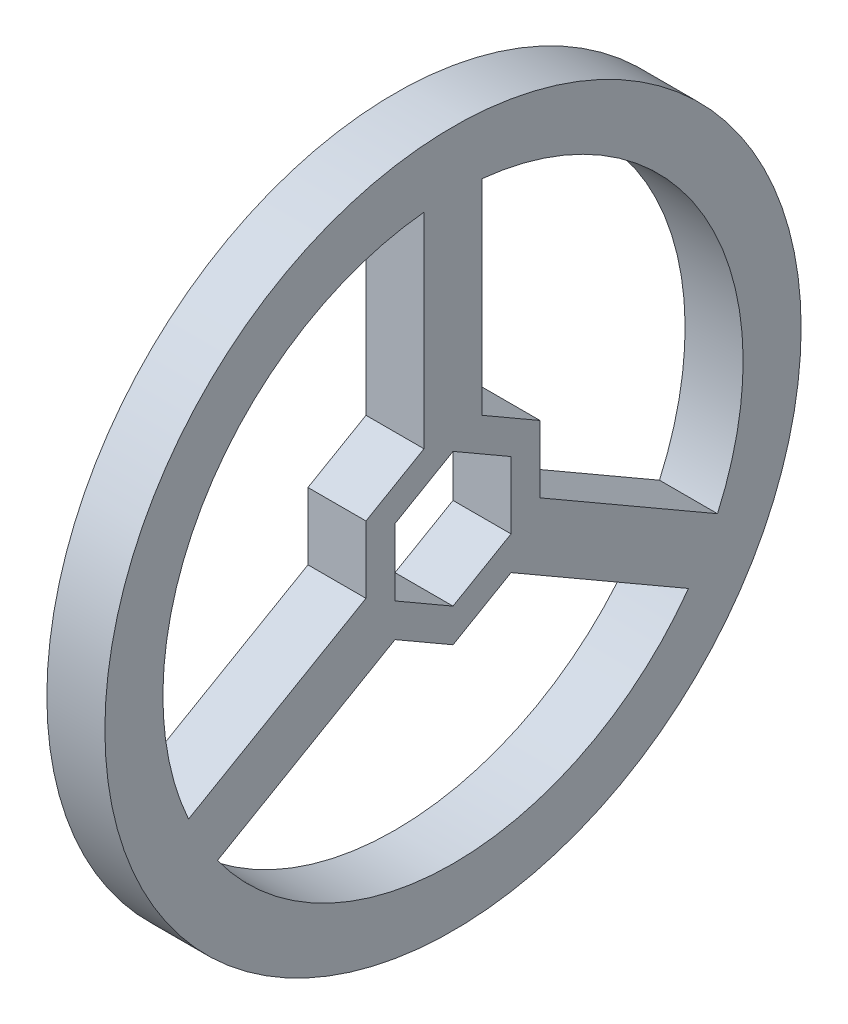
ISO-10303-21;
HEADER;
FILE_DESCRIPTION(('STEP AP214'),'2;1');
FILE_NAME('part.step','',(''),(''),'','','');
FILE_SCHEMA(('AUTOMOTIVE_DESIGN { 1 0 10303 214 1 1 1 1 }'));
ENDSEC;
DATA;
#1=APPLICATION_CONTEXT('core data for automotive mechanical design processes');
#2=APPLICATION_PROTOCOL_DEFINITION('international standard','automotive_design',2000,#1);
#3=PRODUCT_CONTEXT('',#1,'mechanical');
#4=PRODUCT('Part','Part','',(#3));
#5=PRODUCT_RELATED_PRODUCT_CATEGORY('part','',(#4));
#6=PRODUCT_DEFINITION_FORMATION('','',#4);
#7=PRODUCT_DEFINITION_CONTEXT('part definition',#1,'design');
#8=PRODUCT_DEFINITION('design','',#6,#7);
#9=PRODUCT_DEFINITION_SHAPE('','',#8);
#10=(LENGTH_UNIT() NAMED_UNIT(*) SI_UNIT(.MILLI.,.METRE.));
#11=(NAMED_UNIT(*) PLANE_ANGLE_UNIT() SI_UNIT($,.RADIAN.));
#12=(NAMED_UNIT(*) SI_UNIT($,.STERADIAN.) SOLID_ANGLE_UNIT());
#13=UNCERTAINTY_MEASURE_WITH_UNIT(LENGTH_MEASURE(1.E-05),#10,'distance_accuracy_value','');
#14=(GEOMETRIC_REPRESENTATION_CONTEXT(3) GLOBAL_UNCERTAINTY_ASSIGNED_CONTEXT((#13)) GLOBAL_UNIT_ASSIGNED_CONTEXT((#10,
#11,#12)) REPRESENTATION_CONTEXT('',''));
#15=CARTESIAN_POINT('',(0.,0.,0.));
#16=DIRECTION('',(0.,0.,1.));
#17=DIRECTION('',(1.,0.,0.));
#18=AXIS2_PLACEMENT_3D('',#15,#16,#17);
#19=CARTESIAN_POINT('',(5.,2.16506350946109,-1.25000000000001));
#20=DIRECTION('',(0.,0.866025403784436,-0.500000000000004));
#21=DIRECTION('',(0.,0.500000000000004,0.866025403784436));
#22=AXIS2_PLACEMENT_3D('',#19,#20,#21);
#23=PLANE('',#22);
#24=DIRECTION('',(0.,-0.500000000000004,-0.866025403784436));
#25=VECTOR('',#24,1.);
#26=CARTESIAN_POINT('',(0.,2.16506350946109,-1.25000000000001));
#27=LINE('',#26,#25);
#28=CARTESIAN_POINT('',(0.,-1.4433756729741,-7.5));
#29=VERTEX_POINT('',#28);
#30=CARTESIAN_POINT('',(0.,-10.2722794543718,-22.7921099245176));
#31=VERTEX_POINT('',#30);
#32=EDGE_CURVE('E312',#29,#31,#27,.T.);
#33=ORIENTED_EDGE('',*,*,#32,.F.);
#34=DIRECTION('',(-1.,0.,0.));
#35=VECTOR('',#34,1.);
#36=CARTESIAN_POINT('',(5.,-1.4433756729741,-7.5));
#37=LINE('',#36,#35);
#38=CARTESIAN_POINT('',(5.,-1.4433756729741,-7.5));
#39=VERTEX_POINT('',#38);
#40=EDGE_CURVE('E11',#39,#29,#37,.T.);
#41=ORIENTED_EDGE('',*,*,#40,.F.);
#42=DIRECTION('',(0.,-0.500000000000004,-0.866025403784436));
#43=VECTOR('',#42,1.);
#44=CARTESIAN_POINT('',(5.,2.16506350946109,-1.25000000000001));
#45=LINE('',#44,#43);
#46=CARTESIAN_POINT('',(5.,-10.2722794543718,-22.7921099245176));
#47=VERTEX_POINT('',#46);
#48=EDGE_CURVE('E370',#39,#47,#45,.T.);
#49=ORIENTED_EDGE('',*,*,#48,.T.);
#50=DIRECTION('',(-1.,0.,0.));
#51=VECTOR('',#50,1.);
#52=CARTESIAN_POINT('',(5.,-10.2722794543718,-22.7921099245176));
#53=LINE('',#52,#51);
#54=EDGE_CURVE('E58',#47,#31,#53,.T.);
#55=ORIENTED_EDGE('',*,*,#54,.T.);
#56=EDGE_LOOP('',(#33,#41,#49,#55));
#57=FACE_BOUND('',#56,.T.);
#58=ADVANCED_FACE('F39',(#57),#23,.T.);
#59=CARTESIAN_POINT('',(5.,0.,-7.5));
#60=DIRECTION('',(0.,0.,1.));
#61=DIRECTION('',(0.,-1.,0.));
#62=AXIS2_PLACEMENT_3D('',#59,#60,#61);
#63=PLANE('',#62);
#64=DIRECTION('',(0.,1.,0.));
#65=VECTOR('',#64,1.);
#66=CARTESIAN_POINT('',(0.,0.,-7.5));
#67=LINE('',#66,#65);
#68=CARTESIAN_POINT('',(0.,4.3301270189222,-7.5));
#69=VERTEX_POINT('',#68);
#70=EDGE_CURVE('E314',#29,#69,#67,.T.);
#71=ORIENTED_EDGE('',*,*,#70,.T.);
#72=DIRECTION('',(-1.,0.,0.));
#73=VECTOR('',#72,1.);
#74=CARTESIAN_POINT('',(5.,4.3301270189222,-7.5));
#75=LINE('',#74,#73);
#76=CARTESIAN_POINT('',(5.,4.3301270189222,-7.5));
#77=VERTEX_POINT('',#76);
#78=EDGE_CURVE('E49',#77,#69,#75,.T.);
#79=ORIENTED_EDGE('',*,*,#78,.F.);
#80=DIRECTION('',(0.,1.,0.));
#81=VECTOR('',#80,1.);
#82=CARTESIAN_POINT('',(5.,0.,-7.5));
#83=LINE('',#82,#81);
#84=EDGE_CURVE('E205',#39,#77,#83,.T.);
#85=ORIENTED_EDGE('',*,*,#84,.F.);
#86=ORIENTED_EDGE('',*,*,#40,.T.);
#87=EDGE_LOOP('',(#71,#79,#85,#86));
#88=FACE_BOUND('',#87,.T.);
#89=ADVANCED_FACE('F391',(#88),#63,.F.);
#90=CARTESIAN_POINT('',(5.,6.49519052838329,-3.75));
#91=DIRECTION('',(0.,-0.866025403784439,0.5));
#92=DIRECTION('',(0.,-0.5,-0.866025403784439));
#93=AXIS2_PLACEMENT_3D('',#90,#91,#92);
#94=PLANE('',#93);
#95=DIRECTION('',(0.,0.5,0.866025403784439));
#96=VECTOR('',#95,1.);
#97=CARTESIAN_POINT('',(0.,6.49519052838329,-3.75));
#98=LINE('',#97,#96);
#99=CARTESIAN_POINT('',(0.,7.21687836487032,-2.5));
#100=VERTEX_POINT('',#99);
#101=EDGE_CURVE('E211',#69,#100,#98,.T.);
#102=ORIENTED_EDGE('',*,*,#101,.T.);
#103=DIRECTION('',(-1.,0.,0.));
#104=VECTOR('',#103,1.);
#105=CARTESIAN_POINT('',(5.,7.21687836487032,-2.5));
#106=LINE('',#105,#104);
#107=CARTESIAN_POINT('',(5.,7.21687836487032,-2.5));
#108=VERTEX_POINT('',#107);
#109=EDGE_CURVE('E193',#108,#100,#106,.T.);
#110=ORIENTED_EDGE('',*,*,#109,.F.);
#111=DIRECTION('',(0.,0.5,0.866025403784439));
#112=VECTOR('',#111,1.);
#113=CARTESIAN_POINT('',(5.,6.49519052838329,-3.75));
#114=LINE('',#113,#112);
#115=EDGE_CURVE('E198',#77,#108,#114,.T.);
#116=ORIENTED_EDGE('',*,*,#115,.F.);
#117=ORIENTED_EDGE('',*,*,#78,.T.);
#118=EDGE_LOOP('',(#102,#110,#116,#117));
#119=FACE_BOUND('',#118,.T.);
#120=ADVANCED_FACE('F210',(#119),#94,.F.);
#121=CARTESIAN_POINT('',(5.,0.,-2.5));
#122=DIRECTION('',(0.,0.,1.));
#123=DIRECTION('',(1.,0.,0.));
#124=AXIS2_PLACEMENT_3D('',#121,#122,#123);
#125=PLANE('',#124);
#126=DIRECTION('',(0.,1.,0.));
#127=VECTOR('',#126,1.);
#128=CARTESIAN_POINT('',(0.,0.,-2.5));
#129=LINE('',#128,#127);
#130=CARTESIAN_POINT('',(0.,24.8746859276655,-2.5));
#131=VERTEX_POINT('',#130);
#132=EDGE_CURVE('E318',#100,#131,#129,.T.);
#133=ORIENTED_EDGE('',*,*,#132,.T.);
#134=DIRECTION('',(-1.,0.,0.));
#135=VECTOR('',#134,1.);
#136=CARTESIAN_POINT('',(5.,24.8746859276655,-2.5));
#137=LINE('',#136,#135);
#138=CARTESIAN_POINT('',(5.,24.8746859276655,-2.5));
#139=VERTEX_POINT('',#138);
#140=EDGE_CURVE('E123',#139,#131,#137,.T.);
#141=ORIENTED_EDGE('',*,*,#140,.F.);
#142=DIRECTION('',(0.,1.,0.));
#143=VECTOR('',#142,1.);
#144=CARTESIAN_POINT('',(5.,0.,-2.5));
#145=LINE('',#144,#143);
#146=EDGE_CURVE('E189',#108,#139,#145,.T.);
#147=ORIENTED_EDGE('',*,*,#146,.F.);
#148=ORIENTED_EDGE('',*,*,#109,.T.);
#149=EDGE_LOOP('',(#133,#141,#147,#148));
#150=FACE_BOUND('',#149,.T.);
#151=ADVANCED_FACE('F191',(#150),#125,.F.);
#152=CARTESIAN_POINT('',(5.,-4.33012701892219,2.5));
#153=DIRECTION('',(0.,0.866025403784438,-0.5));
#154=DIRECTION('',(0.,0.5,0.866025403784439));
#155=AXIS2_PLACEMENT_3D('',#152,#153,#154);
#156=PLANE('',#155);
#157=DIRECTION('',(0.,-0.5,-0.866025403784439));
#158=VECTOR('',#157,1.);
#159=CARTESIAN_POINT('',(0.,-4.33012701892219,2.5));
#160=LINE('',#159,#158);
#161=CARTESIAN_POINT('',(0.,-2.88675134594813,5.));
#162=VERTEX_POINT('',#161);
#163=CARTESIAN_POINT('',(0.,-5.77350269189626,0.));
#164=VERTEX_POINT('',#163);
#165=EDGE_CURVE('E294',#162,#164,#160,.T.);
#166=ORIENTED_EDGE('',*,*,#165,.F.);
#167=DIRECTION('',(-1.,0.,0.));
#168=VECTOR('',#167,1.);
#169=CARTESIAN_POINT('',(5.,-2.88675134594813,5.));
#170=LINE('',#169,#168);
#171=CARTESIAN_POINT('',(5.,-2.88675134594813,5.));
#172=VERTEX_POINT('',#171);
#173=EDGE_CURVE('E228',#172,#162,#170,.T.);
#174=ORIENTED_EDGE('',*,*,#173,.F.);
#175=DIRECTION('',(0.,-0.5,-0.866025403784439));
#176=VECTOR('',#175,1.);
#177=CARTESIAN_POINT('',(5.,-4.33012701892219,2.5));
#178=LINE('',#177,#176);
#179=CARTESIAN_POINT('',(5.,-5.77350269189626,0.));
#180=VERTEX_POINT('',#179);
#181=EDGE_CURVE('E352',#172,#180,#178,.T.);
#182=ORIENTED_EDGE('',*,*,#181,.T.);
#183=DIRECTION('',(-1.,0.,0.));
#184=VECTOR('',#183,1.);
#185=CARTESIAN_POINT('',(5.,-5.77350269189626,0.));
#186=LINE('',#185,#184);
#187=EDGE_CURVE('E217',#180,#164,#186,.T.);
#188=ORIENTED_EDGE('',*,*,#187,.T.);
#189=EDGE_LOOP('',(#166,#174,#182,#188));
#190=FACE_BOUND('',#189,.T.);
#191=ADVANCED_FACE('F421',(#190),#156,.T.);
#192=CARTESIAN_POINT('',(5.,0.,5.));
#193=DIRECTION('',(0.,0.,-1.));
#194=DIRECTION('',(0.,1.,0.));
#195=AXIS2_PLACEMENT_3D('',#192,#193,#194);
#196=PLANE('',#195);
#197=DIRECTION('',(0.,-1.,0.));
#198=VECTOR('',#197,1.);
#199=CARTESIAN_POINT('',(0.,0.,5.));
#200=LINE('',#199,#198);
#201=CARTESIAN_POINT('',(0.,2.88675134594813,5.));
#202=VERTEX_POINT('',#201);
#203=EDGE_CURVE('E297',#202,#162,#200,.T.);
#204=ORIENTED_EDGE('',*,*,#203,.F.);
#205=DIRECTION('',(-1.,0.,0.));
#206=VECTOR('',#205,1.);
#207=CARTESIAN_POINT('',(5.,2.88675134594813,5.));
#208=LINE('',#207,#206);
#209=CARTESIAN_POINT('',(5.,2.88675134594813,5.));
#210=VERTEX_POINT('',#209);
#211=EDGE_CURVE('E226',#210,#202,#208,.T.);
#212=ORIENTED_EDGE('',*,*,#211,.F.);
#213=DIRECTION('',(0.,-1.,0.));
#214=VECTOR('',#213,1.);
#215=CARTESIAN_POINT('',(5.,0.,5.));
#216=LINE('',#215,#214);
#217=EDGE_CURVE('E355',#210,#172,#216,.T.);
#218=ORIENTED_EDGE('',*,*,#217,.T.);
#219=ORIENTED_EDGE('',*,*,#173,.T.);
#220=EDGE_LOOP('',(#204,#212,#218,#219));
#221=FACE_BOUND('',#220,.T.);
#222=ADVANCED_FACE('F417',(#221),#196,.T.);
#223=CARTESIAN_POINT('',(5.,4.3301270189222,2.5));
#224=DIRECTION('',(0.,-0.866025403784439,-0.5));
#225=DIRECTION('',(0.,0.5,-0.866025403784439));
#226=AXIS2_PLACEMENT_3D('',#223,#224,#225);
#227=PLANE('',#226);
#228=DIRECTION('',(0.,-0.5,0.866025403784439));
#229=VECTOR('',#228,1.);
#230=CARTESIAN_POINT('',(0.,4.3301270189222,2.5));
#231=LINE('',#230,#229);
#232=CARTESIAN_POINT('',(0.,5.77350269189626,0.));
#233=VERTEX_POINT('',#232);
#234=EDGE_CURVE('E300',#233,#202,#231,.T.);
#235=ORIENTED_EDGE('',*,*,#234,.F.);
#236=DIRECTION('',(-1.,0.,0.));
#237=VECTOR('',#236,1.);
#238=CARTESIAN_POINT('',(5.,5.77350269189626,0.));
#239=LINE('',#238,#237);
#240=CARTESIAN_POINT('',(5.,5.77350269189626,0.));
#241=VERTEX_POINT('',#240);
#242=EDGE_CURVE('E224',#241,#233,#239,.T.);
#243=ORIENTED_EDGE('',*,*,#242,.F.);
#244=DIRECTION('',(0.,-0.5,0.866025403784439));
#245=VECTOR('',#244,1.);
#246=CARTESIAN_POINT('',(5.,4.3301270189222,2.5));
#247=LINE('',#246,#245);
#248=EDGE_CURVE('E358',#241,#210,#247,.T.);
#249=ORIENTED_EDGE('',*,*,#248,.T.);
#250=ORIENTED_EDGE('',*,*,#211,.T.);
#251=EDGE_LOOP('',(#235,#243,#249,#250));
#252=FACE_BOUND('',#251,.T.);
#253=ADVANCED_FACE('F413',(#252),#227,.T.);
#254=CARTESIAN_POINT('',(5.,4.3301270189222,-2.5));
#255=DIRECTION('',(0.,-0.866025403784439,0.5));
#256=DIRECTION('',(0.,-0.5,-0.866025403784439));
#257=AXIS2_PLACEMENT_3D('',#254,#255,#256);
#258=PLANE('',#257);
#259=DIRECTION('',(0.,0.5,0.866025403784439));
#260=VECTOR('',#259,1.);
#261=CARTESIAN_POINT('',(0.,4.3301270189222,-2.5));
#262=LINE('',#261,#260);
#263=CARTESIAN_POINT('',(0.,2.88675134594813,-5.));
#264=VERTEX_POINT('',#263);
#265=EDGE_CURVE('E303',#264,#233,#262,.T.);
#266=ORIENTED_EDGE('',*,*,#265,.F.);
#267=DIRECTION('',(-1.,0.,0.));
#268=VECTOR('',#267,1.);
#269=CARTESIAN_POINT('',(5.,2.88675134594813,-5.));
#270=LINE('',#269,#268);
#271=CARTESIAN_POINT('',(5.,2.88675134594813,-5.));
#272=VERTEX_POINT('',#271);
#273=EDGE_CURVE('E222',#272,#264,#270,.T.);
#274=ORIENTED_EDGE('',*,*,#273,.F.);
#275=DIRECTION('',(0.,0.5,0.866025403784439));
#276=VECTOR('',#275,1.);
#277=CARTESIAN_POINT('',(5.,4.3301270189222,-2.5));
#278=LINE('',#277,#276);
#279=EDGE_CURVE('E361',#272,#241,#278,.T.);
#280=ORIENTED_EDGE('',*,*,#279,.T.);
#281=ORIENTED_EDGE('',*,*,#242,.T.);
#282=EDGE_LOOP('',(#266,#274,#280,#281));
#283=FACE_BOUND('',#282,.T.);
#284=ADVANCED_FACE('F409',(#283),#258,.T.);
#285=CARTESIAN_POINT('',(5.,0.,-5.));
#286=DIRECTION('',(0.,0.,1.));
#287=DIRECTION('',(0.,-1.,0.));
#288=AXIS2_PLACEMENT_3D('',#285,#286,#287);
#289=PLANE('',#288);
#290=DIRECTION('',(0.,1.,0.));
#291=VECTOR('',#290,1.);
#292=CARTESIAN_POINT('',(0.,0.,-5.));
#293=LINE('',#292,#291);
#294=CARTESIAN_POINT('',(0.,-2.88675134594813,-5.));
#295=VERTEX_POINT('',#294);
#296=EDGE_CURVE('E306',#295,#264,#293,.T.);
#297=ORIENTED_EDGE('',*,*,#296,.F.);
#298=DIRECTION('',(-1.,0.,0.));
#299=VECTOR('',#298,1.);
#300=CARTESIAN_POINT('',(5.,-2.88675134594813,-5.));
#301=LINE('',#300,#299);
#302=CARTESIAN_POINT('',(5.,-2.88675134594813,-5.));
#303=VERTEX_POINT('',#302);
#304=EDGE_CURVE('E219',#303,#295,#301,.T.);
#305=ORIENTED_EDGE('',*,*,#304,.F.);
#306=DIRECTION('',(0.,1.,0.));
#307=VECTOR('',#306,1.);
#308=CARTESIAN_POINT('',(5.,0.,-5.));
#309=LINE('',#308,#307);
#310=EDGE_CURVE('E364',#303,#272,#309,.T.);
#311=ORIENTED_EDGE('',*,*,#310,.T.);
#312=ORIENTED_EDGE('',*,*,#273,.T.);
#313=EDGE_LOOP('',(#297,#305,#311,#312));
#314=FACE_BOUND('',#313,.T.);
#315=ADVANCED_FACE('F405',(#314),#289,.T.);
#316=CARTESIAN_POINT('',(5.,0.,7.5));
#317=DIRECTION('',(0.,0.,-1.));
#318=DIRECTION('',(0.,1.,0.));
#319=AXIS2_PLACEMENT_3D('',#316,#317,#318);
#320=PLANE('',#319);
#321=DIRECTION('',(0.,-1.,0.));
#322=VECTOR('',#321,1.);
#323=CARTESIAN_POINT('',(0.,0.,7.5));
#324=LINE('',#323,#322);
#325=CARTESIAN_POINT('',(0.,4.3301270189222,7.5));
#326=VERTEX_POINT('',#325);
#327=CARTESIAN_POINT('',(0.,-1.44337567297399,7.5));
#328=VERTEX_POINT('',#327);
#329=EDGE_CURVE('E280',#326,#328,#324,.T.);
#330=ORIENTED_EDGE('',*,*,#329,.T.);
#331=DIRECTION('',(-1.,0.,0.));
#332=VECTOR('',#331,1.);
#333=CARTESIAN_POINT('',(5.,-1.44337567297399,7.5));
#334=LINE('',#333,#332);
#335=CARTESIAN_POINT('',(5.,-1.44337567297399,7.5));
#336=VERTEX_POINT('',#335);
#337=EDGE_CURVE('E220',#336,#328,#334,.T.);
#338=ORIENTED_EDGE('',*,*,#337,.F.);
#339=DIRECTION('',(0.,-1.,0.));
#340=VECTOR('',#339,1.);
#341=CARTESIAN_POINT('',(5.,0.,7.5));
#342=LINE('',#341,#340);
#343=CARTESIAN_POINT('',(5.,4.3301270189222,7.5));
#344=VERTEX_POINT('',#343);
#345=EDGE_CURVE('E339',#344,#336,#342,.T.);
#346=ORIENTED_EDGE('',*,*,#345,.F.);
#347=DIRECTION('',(-1.,0.,0.));
#348=VECTOR('',#347,1.);
#349=CARTESIAN_POINT('',(5.,4.3301270189222,7.5));
#350=LINE('',#349,#348);
#351=EDGE_CURVE('E230',#344,#326,#350,.T.);
#352=ORIENTED_EDGE('',*,*,#351,.T.);
#353=EDGE_LOOP('',(#330,#338,#346,#352));
#354=FACE_BOUND('',#353,.T.);
#355=ADVANCED_FACE('F408',(#354),#320,.F.);
#356=CARTESIAN_POINT('',(5.,2.16506350946111,1.24999999999998));
#357=DIRECTION('',(0.,-0.866025403784443,-0.499999999999992));
#358=DIRECTION('',(0.,0.499999999999992,-0.866025403784443));
#359=AXIS2_PLACEMENT_3D('',#356,#357,#358);
#360=PLANE('',#359);
#361=DIRECTION('',(0.,-0.499999999999992,0.866025403784443));
#362=VECTOR('',#361,1.);
#363=CARTESIAN_POINT('',(0.,2.16506350946111,1.24999999999998));
#364=LINE('',#363,#362);
#365=CARTESIAN_POINT('',(0.,-10.2722794543714,22.7921099245177));
#366=VERTEX_POINT('',#365);
#367=EDGE_CURVE('E283',#328,#366,#364,.T.);
#368=ORIENTED_EDGE('',*,*,#367,.T.);
#369=DIRECTION('',(-1.,0.,0.));
#370=VECTOR('',#369,1.);
#371=CARTESIAN_POINT('',(5.,-10.2722794543714,22.7921099245177));
#372=LINE('',#371,#370);
#373=CARTESIAN_POINT('',(5.,-10.2722794543714,22.7921099245177));
#374=VERTEX_POINT('',#373);
#375=EDGE_CURVE('E237',#374,#366,#372,.T.);
#376=ORIENTED_EDGE('',*,*,#375,.F.);
#377=DIRECTION('',(0.,-0.499999999999992,0.866025403784443));
#378=VECTOR('',#377,1.);
#379=CARTESIAN_POINT('',(5.,2.16506350946111,1.24999999999998));
#380=LINE('',#379,#378);
#381=EDGE_CURVE('E342',#336,#374,#380,.T.);
#382=ORIENTED_EDGE('',*,*,#381,.F.);
#383=ORIENTED_EDGE('',*,*,#337,.T.);
#384=EDGE_LOOP('',(#368,#376,#382,#383));
#385=FACE_BOUND('',#384,.T.);
#386=ADVANCED_FACE('F436',(#385),#360,.F.);
#387=CARTESIAN_POINT('',(5.,0.,0.));
#388=DIRECTION('',(-1.,0.,0.));
#389=DIRECTION('',(0.,0.,1.));
#390=AXIS2_PLACEMENT_3D('',#387,#388,#389);
#391=CYLINDRICAL_SURFACE('',#390,25.);
#392=CARTESIAN_POINT('',(0.,0.,0.));
#393=DIRECTION('',(1.,0.,0.));
#394=DIRECTION('',(0.,0.,-1.));
#395=AXIS2_PLACEMENT_3D('',#392,#393,#394);
#396=CIRCLE('',#395,25.);
#397=CARTESIAN_POINT('',(0.,24.8746859276655,2.5));
#398=VERTEX_POINT('',#397);
#399=EDGE_CURVE('E286',#398,#366,#396,.T.);
#400=ORIENTED_EDGE('',*,*,#399,.F.);
#401=DIRECTION('',(-1.,0.,0.));
#402=VECTOR('',#401,1.);
#403=CARTESIAN_POINT('',(5.,24.8746859276655,2.5));
#404=LINE('',#403,#402);
#405=CARTESIAN_POINT('',(5.,24.8746859276655,2.5));
#406=VERTEX_POINT('',#405);
#407=EDGE_CURVE('E235',#406,#398,#404,.T.);
#408=ORIENTED_EDGE('',*,*,#407,.F.);
#409=CARTESIAN_POINT('',(5.,0.,0.));
#410=DIRECTION('',(1.,0.,0.));
#411=DIRECTION('',(0.,0.,-1.));
#412=AXIS2_PLACEMENT_3D('',#409,#410,#411);
#413=CIRCLE('',#412,25.);
#414=EDGE_CURVE('E344',#406,#374,#413,.T.);
#415=ORIENTED_EDGE('',*,*,#414,.T.);
#416=ORIENTED_EDGE('',*,*,#375,.T.);
#417=EDGE_LOOP('',(#400,#408,#415,#416));
#418=FACE_BOUND('',#417,.T.);
#419=ADVANCED_FACE('F432',(#418),#391,.F.);
#420=CARTESIAN_POINT('',(5.,0.,2.5));
#421=DIRECTION('',(0.,0.,1.));
#422=DIRECTION('',(1.,0.,0.));
#423=AXIS2_PLACEMENT_3D('',#420,#421,#422);
#424=PLANE('',#423);
#425=DIRECTION('',(0.,1.,0.));
#426=VECTOR('',#425,1.);
#427=CARTESIAN_POINT('',(0.,0.,2.5));
#428=LINE('',#427,#426);
#429=CARTESIAN_POINT('',(0.,7.21687836487032,2.5));
#430=VERTEX_POINT('',#429);
#431=EDGE_CURVE('E289',#430,#398,#428,.T.);
#432=ORIENTED_EDGE('',*,*,#431,.F.);
#433=DIRECTION('',(-1.,0.,0.));
#434=VECTOR('',#433,1.);
#435=CARTESIAN_POINT('',(5.,7.21687836487032,2.5));
#436=LINE('',#435,#434);
#437=CARTESIAN_POINT('',(5.,7.21687836487032,2.5));
#438=VERTEX_POINT('',#437);
#439=EDGE_CURVE('E233',#438,#430,#436,.T.);
#440=ORIENTED_EDGE('',*,*,#439,.F.);
#441=DIRECTION('',(0.,1.,0.));
#442=VECTOR('',#441,1.);
#443=CARTESIAN_POINT('',(5.,0.,2.5));
#444=LINE('',#443,#442);
#445=EDGE_CURVE('E347',#438,#406,#444,.T.);
#446=ORIENTED_EDGE('',*,*,#445,.T.);
#447=ORIENTED_EDGE('',*,*,#407,.T.);
#448=EDGE_LOOP('',(#432,#440,#446,#447));
#449=FACE_BOUND('',#448,.T.);
#450=ADVANCED_FACE('F429',(#449),#424,.T.);
#451=CARTESIAN_POINT('',(5.,-2.16506350946111,-1.24999999999998));
#452=DIRECTION('',(0.,-0.866025403784443,-0.499999999999992));
#453=DIRECTION('',(0.,0.499999999999992,-0.866025403784443));
#454=AXIS2_PLACEMENT_3D('',#451,#452,#453);
#455=PLANE('',#454);
#456=DIRECTION('',(0.,-0.499999999999992,0.866025403784443));
#457=VECTOR('',#456,1.);
#458=CARTESIAN_POINT('',(0.,-2.16506350946111,-1.24999999999998));
#459=LINE('',#458,#457);
#460=CARTESIAN_POINT('',(0.,-5.77350269189622,5.00000000000007));
#461=VERTEX_POINT('',#460);
#462=CARTESIAN_POINT('',(0.,-14.6024064732937,20.2921099245177));
#463=VERTEX_POINT('',#462);
#464=EDGE_CURVE('E265',#461,#463,#459,.T.);
#465=ORIENTED_EDGE('',*,*,#464,.F.);
#466=DIRECTION('',(-1.,0.,0.));
#467=VECTOR('',#466,1.);
#468=CARTESIAN_POINT('',(5.,-5.77350269189622,5.00000000000007));
#469=LINE('',#468,#467);
#470=CARTESIAN_POINT('',(5.,-5.77350269189622,5.00000000000007));
#471=VERTEX_POINT('',#470);
#472=EDGE_CURVE('E43',#471,#461,#469,.T.);
#473=ORIENTED_EDGE('',*,*,#472,.F.);
#474=DIRECTION('',(0.,-0.499999999999992,0.866025403784443));
#475=VECTOR('',#474,1.);
#476=CARTESIAN_POINT('',(5.,-2.16506350946111,-1.24999999999998));
#477=LINE('',#476,#475);
#478=CARTESIAN_POINT('',(5.,-14.6024064732937,20.2921099245177));
#479=VERTEX_POINT('',#478);
#480=EDGE_CURVE('E325',#471,#479,#477,.T.);
#481=ORIENTED_EDGE('',*,*,#480,.T.);
#482=DIRECTION('',(-1.,0.,0.));
#483=VECTOR('',#482,1.);
#484=CARTESIAN_POINT('',(5.,-14.6024064732937,20.2921099245177));
#485=LINE('',#484,#483);
#486=EDGE_CURVE('E241',#479,#463,#485,.T.);
#487=ORIENTED_EDGE('',*,*,#486,.T.);
#488=EDGE_LOOP('',(#465,#473,#481,#487));
#489=FACE_BOUND('',#488,.T.);
#490=ADVANCED_FACE('F41',(#489),#455,.T.);
#491=CARTESIAN_POINT('',(5.,-6.49519052838329,3.75));
#492=DIRECTION('',(0.,0.866025403784439,-0.5));
#493=DIRECTION('',(0.,0.5,0.866025403784439));
#494=AXIS2_PLACEMENT_3D('',#491,#492,#493);
#495=PLANE('',#494);
#496=DIRECTION('',(0.,-0.5,-0.866025403784439));
#497=VECTOR('',#496,1.);
#498=CARTESIAN_POINT('',(0.,-6.49519052838329,3.75));
#499=LINE('',#498,#497);
#500=CARTESIAN_POINT('',(0.,-8.66025403784439,0.));
#501=VERTEX_POINT('',#500);
#502=EDGE_CURVE('E257',#461,#501,#499,.T.);
#503=ORIENTED_EDGE('',*,*,#502,.T.);
#504=DIRECTION('',(-1.,0.,0.));
#505=VECTOR('',#504,1.);
#506=CARTESIAN_POINT('',(5.,-8.66025403784439,0.));
#507=LINE('',#506,#505);
#508=CARTESIAN_POINT('',(5.,-8.66025403784439,0.));
#509=VERTEX_POINT('',#508);
#510=EDGE_CURVE('E248',#509,#501,#507,.T.);
#511=ORIENTED_EDGE('',*,*,#510,.F.);
#512=DIRECTION('',(0.,-0.5,-0.866025403784439));
#513=VECTOR('',#512,1.);
#514=CARTESIAN_POINT('',(5.,-6.49519052838329,3.75));
#515=LINE('',#514,#513);
#516=EDGE_CURVE('E258',#471,#509,#515,.T.);
#517=ORIENTED_EDGE('',*,*,#516,.F.);
#518=ORIENTED_EDGE('',*,*,#472,.T.);
#519=EDGE_LOOP('',(#503,#511,#517,#518));
#520=FACE_BOUND('',#519,.T.);
#521=ADVANCED_FACE('F256',(#520),#495,.F.);
#522=CARTESIAN_POINT('',(5.,-6.49519052838329,-3.75));
#523=DIRECTION('',(0.,0.866025403784439,0.5));
#524=DIRECTION('',(0.,-0.5,0.866025403784439));
#525=AXIS2_PLACEMENT_3D('',#522,#523,#524);
#526=PLANE('',#525);
#527=DIRECTION('',(0.,0.5,-0.866025403784439));
#528=VECTOR('',#527,1.);
#529=CARTESIAN_POINT('',(0.,-6.49519052838329,-3.75));
#530=LINE('',#529,#528);
#531=CARTESIAN_POINT('',(0.,-5.77350269189628,-4.99999999999997));
#532=VERTEX_POINT('',#531);
#533=EDGE_CURVE('E268',#501,#532,#530,.T.);
#534=ORIENTED_EDGE('',*,*,#533,.T.);
#535=DIRECTION('',(-1.,0.,0.));
#536=VECTOR('',#535,1.);
#537=CARTESIAN_POINT('',(5.,-5.77350269189628,-4.99999999999997));
#538=LINE('',#537,#536);
#539=CARTESIAN_POINT('',(5.,-5.77350269189628,-4.99999999999997));
#540=VERTEX_POINT('',#539);
#541=EDGE_CURVE('E246',#540,#532,#538,.T.);
#542=ORIENTED_EDGE('',*,*,#541,.F.);
#543=DIRECTION('',(0.,0.5,-0.866025403784439));
#544=VECTOR('',#543,1.);
#545=CARTESIAN_POINT('',(5.,-6.49519052838329,-3.75));
#546=LINE('',#545,#544);
#547=EDGE_CURVE('E330',#509,#540,#546,.T.);
#548=ORIENTED_EDGE('',*,*,#547,.F.);
#549=ORIENTED_EDGE('',*,*,#510,.T.);
#550=EDGE_LOOP('',(#534,#542,#548,#549));
#551=FACE_BOUND('',#550,.T.);
#552=ADVANCED_FACE('F447',(#551),#526,.F.);
#553=CARTESIAN_POINT('',(5.,-2.16506350946109,1.25000000000001));
#554=DIRECTION('',(0.,0.866025403784436,-0.500000000000004));
#555=DIRECTION('',(0.,0.500000000000004,0.866025403784436));
#556=AXIS2_PLACEMENT_3D('',#553,#554,#555);
#557=PLANE('',#556);
#558=DIRECTION('',(0.,-0.500000000000004,-0.866025403784436));
#559=VECTOR('',#558,1.);
#560=CARTESIAN_POINT('',(0.,-2.16506350946109,1.25000000000001));
#561=LINE('',#560,#559);
#562=CARTESIAN_POINT('',(0.,-14.6024064732939,-20.2921099245175));
#563=VERTEX_POINT('',#562);
#564=EDGE_CURVE('E275',#532,#563,#561,.T.);
#565=ORIENTED_EDGE('',*,*,#564,.T.);
#566=DIRECTION('',(-1.,0.,0.));
#567=VECTOR('',#566,1.);
#568=CARTESIAN_POINT('',(5.,-14.6024064732939,-20.2921099245175));
#569=LINE('',#568,#567);
#570=CARTESIAN_POINT('',(5.,-14.6024064732939,-20.2921099245175));
#571=VERTEX_POINT('',#570);
#572=EDGE_CURVE('E243',#571,#563,#569,.T.);
#573=ORIENTED_EDGE('',*,*,#572,.F.);
#574=DIRECTION('',(0.,-0.500000000000004,-0.866025403784436));
#575=VECTOR('',#574,1.);
#576=CARTESIAN_POINT('',(5.,-2.16506350946109,1.25000000000001));
#577=LINE('',#576,#575);
#578=EDGE_CURVE('E334',#540,#571,#577,.T.);
#579=ORIENTED_EDGE('',*,*,#578,.F.);
#580=ORIENTED_EDGE('',*,*,#541,.T.);
#581=EDGE_LOOP('',(#565,#573,#579,#580));
#582=FACE_BOUND('',#581,.T.);
#583=ADVANCED_FACE('F444',(#582),#557,.F.);
#584=CARTESIAN_POINT('',(5.,0.,0.));
#585=DIRECTION('',(-1.,0.,0.));
#586=DIRECTION('',(0.,0.,1.));
#587=AXIS2_PLACEMENT_3D('',#584,#585,#586);
#588=CYLINDRICAL_SURFACE('',#587,25.);
#589=CARTESIAN_POINT('',(0.,0.,0.));
#590=DIRECTION('',(1.,0.,0.));
#591=DIRECTION('',(0.,0.,-1.));
#592=AXIS2_PLACEMENT_3D('',#589,#590,#591);
#593=CIRCLE('',#592,25.);
#594=EDGE_CURVE('E320',#31,#131,#593,.T.);
#595=ORIENTED_EDGE('',*,*,#594,.F.);
#596=ORIENTED_EDGE('',*,*,#54,.F.);
#597=CARTESIAN_POINT('',(5.,0.,0.));
#598=DIRECTION('',(1.,0.,0.));
#599=DIRECTION('',(0.,0.,-1.));
#600=AXIS2_PLACEMENT_3D('',#597,#598,#599);
#601=CIRCLE('',#600,25.);
#602=EDGE_CURVE('E197',#47,#139,#601,.T.);
#603=ORIENTED_EDGE('',*,*,#602,.T.);
#604=ORIENTED_EDGE('',*,*,#140,.T.);
#605=EDGE_LOOP('',(#595,#596,#603,#604));
#606=FACE_BOUND('',#605,.T.);
#607=ADVANCED_FACE('F403',(#606),#588,.F.);
#608=CARTESIAN_POINT('',(5.,-4.33012701892219,-2.5));
#609=DIRECTION('',(0.,0.866025403784439,0.5));
#610=DIRECTION('',(0.,-0.5,0.866025403784439));
#611=AXIS2_PLACEMENT_3D('',#608,#609,#610);
#612=PLANE('',#611);
#613=DIRECTION('',(0.,0.5,-0.866025403784439));
#614=VECTOR('',#613,1.);
#615=CARTESIAN_POINT('',(0.,-4.33012701892219,-2.5));
#616=LINE('',#615,#614);
#617=EDGE_CURVE('E309',#164,#295,#616,.T.);
#618=ORIENTED_EDGE('',*,*,#617,.F.);
#619=ORIENTED_EDGE('',*,*,#187,.F.);
#620=DIRECTION('',(0.,0.5,-0.866025403784439));
#621=VECTOR('',#620,1.);
#622=CARTESIAN_POINT('',(5.,-4.33012701892219,-2.5));
#623=LINE('',#622,#621);
#624=EDGE_CURVE('E367',#180,#303,#623,.T.);
#625=ORIENTED_EDGE('',*,*,#624,.T.);
#626=ORIENTED_EDGE('',*,*,#304,.T.);
#627=EDGE_LOOP('',(#618,#619,#625,#626));
#628=FACE_BOUND('',#627,.T.);
#629=ADVANCED_FACE('F400',(#628),#612,.T.);
#630=CARTESIAN_POINT('',(5.,6.49519052838329,3.75));
#631=DIRECTION('',(0.,-0.866025403784439,-0.5));
#632=DIRECTION('',(0.,0.5,-0.866025403784439));
#633=AXIS2_PLACEMENT_3D('',#630,#631,#632);
#634=PLANE('',#633);
#635=DIRECTION('',(0.,-0.5,0.866025403784439));
#636=VECTOR('',#635,1.);
#637=CARTESIAN_POINT('',(0.,6.49519052838329,3.75));
#638=LINE('',#637,#636);
#639=EDGE_CURVE('E292',#430,#326,#638,.T.);
#640=ORIENTED_EDGE('',*,*,#639,.T.);
#641=ORIENTED_EDGE('',*,*,#351,.F.);
#642=DIRECTION('',(0.,-0.5,0.866025403784439));
#643=VECTOR('',#642,1.);
#644=CARTESIAN_POINT('',(5.,6.49519052838329,3.75));
#645=LINE('',#644,#643);
#646=EDGE_CURVE('E350',#438,#344,#645,.T.);
#647=ORIENTED_EDGE('',*,*,#646,.F.);
#648=ORIENTED_EDGE('',*,*,#439,.T.);
#649=EDGE_LOOP('',(#640,#641,#647,#648));
#650=FACE_BOUND('',#649,.T.);
#651=ADVANCED_FACE('F385',(#650),#634,.F.);
#652=CARTESIAN_POINT('',(5.,0.,0.));
#653=DIRECTION('',(-1.,0.,0.));
#654=DIRECTION('',(0.,0.,1.));
#655=AXIS2_PLACEMENT_3D('',#652,#653,#654);
#656=CYLINDRICAL_SURFACE('',#655,25.);
#657=CARTESIAN_POINT('',(0.,0.,0.));
#658=DIRECTION('',(1.,0.,0.));
#659=DIRECTION('',(0.,0.,-1.));
#660=AXIS2_PLACEMENT_3D('',#657,#658,#659);
#661=CIRCLE('',#660,25.);
#662=EDGE_CURVE('E278',#463,#563,#661,.T.);
#663=ORIENTED_EDGE('',*,*,#662,.F.);
#664=ORIENTED_EDGE('',*,*,#486,.F.);
#665=CARTESIAN_POINT('',(5.,0.,0.));
#666=DIRECTION('',(1.,0.,0.));
#667=DIRECTION('',(0.,0.,-1.));
#668=AXIS2_PLACEMENT_3D('',#665,#666,#667);
#669=CIRCLE('',#668,25.);
#670=EDGE_CURVE('E336',#479,#571,#669,.T.);
#671=ORIENTED_EDGE('',*,*,#670,.T.);
#672=ORIENTED_EDGE('',*,*,#572,.T.);
#673=EDGE_LOOP('',(#663,#664,#671,#672));
#674=FACE_BOUND('',#673,.T.);
#675=ADVANCED_FACE('F377',(#674),#656,.F.);
#676=CARTESIAN_POINT('',(5.,0.,0.));
#677=DIRECTION('',(-1.,0.,0.));
#678=DIRECTION('',(0.,0.,1.));
#679=AXIS2_PLACEMENT_3D('',#676,#677,#678);
#680=CYLINDRICAL_SURFACE('',#679,30.);
#681=CARTESIAN_POINT('',(5.,0.,0.));
#682=DIRECTION('',(1.,0.,0.));
#683=DIRECTION('',(0.,0.,-1.));
#684=AXIS2_PLACEMENT_3D('',#681,#682,#683);
#685=CIRCLE('',#684,30.);
#686=CARTESIAN_POINT('',(5.,0.,-30.));
#687=VERTEX_POINT('',#686);
#688=EDGE_CURVE('E244',#687,#687,#685,.T.);
#689=ORIENTED_EDGE('',*,*,#688,.F.);
#690=EDGE_LOOP('',(#689));
#691=FACE_BOUND('',#690,.T.);
#692=CARTESIAN_POINT('',(0.,0.,0.));
#693=DIRECTION('',(1.,0.,0.));
#694=DIRECTION('',(0.,0.,-1.));
#695=AXIS2_PLACEMENT_3D('',#692,#693,#694);
#696=CIRCLE('',#695,30.);
#697=CARTESIAN_POINT('',(0.,0.,-30.));
#698=VERTEX_POINT('',#697);
#699=EDGE_CURVE('E323',#698,#698,#696,.T.);
#700=ORIENTED_EDGE('',*,*,#699,.T.);
#701=EDGE_LOOP('',(#700));
#702=FACE_BOUND('',#701,.T.);
#703=ADVANCED_FACE('F375',(#691,#702),#680,.T.);
#704=CARTESIAN_POINT('',(5.,0.,0.));
#705=DIRECTION('',(1.,0.,0.));
#706=DIRECTION('',(0.,0.,-1.));
#707=AXIS2_PLACEMENT_3D('',#704,#705,#706);
#708=PLANE('',#707);
#709=ORIENTED_EDGE('',*,*,#480,.F.);
#710=ORIENTED_EDGE('',*,*,#516,.T.);
#711=ORIENTED_EDGE('',*,*,#547,.T.);
#712=ORIENTED_EDGE('',*,*,#578,.T.);
#713=ORIENTED_EDGE('',*,*,#670,.F.);
#714=EDGE_LOOP('',(#709,#710,#711,#712,#713));
#715=FACE_BOUND('',#714,.T.);
#716=ORIENTED_EDGE('',*,*,#345,.T.);
#717=ORIENTED_EDGE('',*,*,#381,.T.);
#718=ORIENTED_EDGE('',*,*,#414,.F.);
#719=ORIENTED_EDGE('',*,*,#445,.F.);
#720=ORIENTED_EDGE('',*,*,#646,.T.);
#721=EDGE_LOOP('',(#716,#717,#718,#719,#720));
#722=FACE_BOUND('',#721,.T.);
#723=ORIENTED_EDGE('',*,*,#181,.F.);
#724=ORIENTED_EDGE('',*,*,#217,.F.);
#725=ORIENTED_EDGE('',*,*,#248,.F.);
#726=ORIENTED_EDGE('',*,*,#279,.F.);
#727=ORIENTED_EDGE('',*,*,#310,.F.);
#728=ORIENTED_EDGE('',*,*,#624,.F.);
#729=EDGE_LOOP('',(#723,#724,#725,#726,#727,#728));
#730=FACE_BOUND('',#729,.T.);
#731=ORIENTED_EDGE('',*,*,#48,.F.);
#732=ORIENTED_EDGE('',*,*,#84,.T.);
#733=ORIENTED_EDGE('',*,*,#115,.T.);
#734=ORIENTED_EDGE('',*,*,#146,.T.);
#735=ORIENTED_EDGE('',*,*,#602,.F.);
#736=EDGE_LOOP('',(#731,#732,#733,#734,#735));
#737=FACE_BOUND('',#736,.T.);
#738=ORIENTED_EDGE('',*,*,#688,.T.);
#739=EDGE_LOOP('',(#738));
#740=FACE_BOUND('',#739,.T.);
#741=ADVANCED_FACE('F202',(#715,#722,#730,#737,#740),#708,.T.);
#742=CARTESIAN_POINT('',(0.,0.,0.));
#743=DIRECTION('',(1.,0.,0.));
#744=DIRECTION('',(0.,0.,-1.));
#745=AXIS2_PLACEMENT_3D('',#742,#743,#744);
#746=PLANE('',#745);
#747=ORIENTED_EDGE('',*,*,#464,.T.);
#748=ORIENTED_EDGE('',*,*,#662,.T.);
#749=ORIENTED_EDGE('',*,*,#564,.F.);
#750=ORIENTED_EDGE('',*,*,#533,.F.);
#751=ORIENTED_EDGE('',*,*,#502,.F.);
#752=EDGE_LOOP('',(#747,#748,#749,#750,#751));
#753=FACE_BOUND('',#752,.T.);
#754=ORIENTED_EDGE('',*,*,#329,.F.);
#755=ORIENTED_EDGE('',*,*,#639,.F.);
#756=ORIENTED_EDGE('',*,*,#431,.T.);
#757=ORIENTED_EDGE('',*,*,#399,.T.);
#758=ORIENTED_EDGE('',*,*,#367,.F.);
#759=EDGE_LOOP('',(#754,#755,#756,#757,#758));
#760=FACE_BOUND('',#759,.T.);
#761=ORIENTED_EDGE('',*,*,#165,.T.);
#762=ORIENTED_EDGE('',*,*,#617,.T.);
#763=ORIENTED_EDGE('',*,*,#296,.T.);
#764=ORIENTED_EDGE('',*,*,#265,.T.);
#765=ORIENTED_EDGE('',*,*,#234,.T.);
#766=ORIENTED_EDGE('',*,*,#203,.T.);
#767=EDGE_LOOP('',(#761,#762,#763,#764,#765,#766));
#768=FACE_BOUND('',#767,.T.);
#769=ORIENTED_EDGE('',*,*,#32,.T.);
#770=ORIENTED_EDGE('',*,*,#594,.T.);
#771=ORIENTED_EDGE('',*,*,#132,.F.);
#772=ORIENTED_EDGE('',*,*,#101,.F.);
#773=ORIENTED_EDGE('',*,*,#70,.F.);
#774=EDGE_LOOP('',(#769,#770,#771,#772,#773));
#775=FACE_BOUND('',#774,.T.);
#776=ORIENTED_EDGE('',*,*,#699,.F.);
#777=EDGE_LOOP('',(#776));
#778=FACE_BOUND('',#777,.T.);
#779=ADVANCED_FACE('F262',(#753,#760,#768,#775,#778),#746,.F.);
#780=CLOSED_SHELL('',(#58,#89,#120,#151,#191,#222,#253,#284,#315,#355,#386,#419,#450,#490,#521,
#552,#583,#607,#629,#651,#675,#703,#741,#779));
#781=MANIFOLD_SOLID_BREP('B2',#780);
#782=ADVANCED_BREP_SHAPE_REPRESENTATION('',(#18,#781),#14);
#783=SHAPE_DEFINITION_REPRESENTATION(#9,#782);
ENDSEC;
END-ISO-10303-21;
